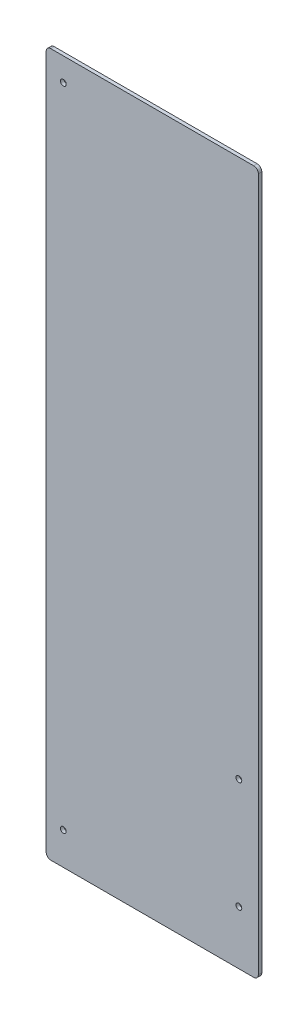
ISO-10303-21;
HEADER;
FILE_DESCRIPTION(('STEP AP214'),'2;1');
FILE_NAME('part.step','',(''),(''),'','','');
FILE_SCHEMA(('AUTOMOTIVE_DESIGN { 1 0 10303 214 1 1 1 1 }'));
ENDSEC;
DATA;
#1=APPLICATION_CONTEXT('core data for automotive mechanical design processes');
#2=APPLICATION_PROTOCOL_DEFINITION('international standard','automotive_design',2000,#1);
#3=PRODUCT_CONTEXT('',#1,'mechanical');
#4=PRODUCT('Part','Part','',(#3));
#5=PRODUCT_RELATED_PRODUCT_CATEGORY('part','',(#4));
#6=PRODUCT_DEFINITION_FORMATION('','',#4);
#7=PRODUCT_DEFINITION_CONTEXT('part definition',#1,'design');
#8=PRODUCT_DEFINITION('design','',#6,#7);
#9=PRODUCT_DEFINITION_SHAPE('','',#8);
#10=(LENGTH_UNIT() NAMED_UNIT(*) SI_UNIT(.MILLI.,.METRE.));
#11=(NAMED_UNIT(*) PLANE_ANGLE_UNIT() SI_UNIT($,.RADIAN.));
#12=(NAMED_UNIT(*) SI_UNIT($,.STERADIAN.) SOLID_ANGLE_UNIT());
#13=UNCERTAINTY_MEASURE_WITH_UNIT(LENGTH_MEASURE(1.E-05),#10,'distance_accuracy_value','');
#14=(GEOMETRIC_REPRESENTATION_CONTEXT(3) GLOBAL_UNCERTAINTY_ASSIGNED_CONTEXT((#13)) GLOBAL_UNIT_ASSIGNED_CONTEXT((#10,
#11,#12)) REPRESENTATION_CONTEXT('',''));
#15=CARTESIAN_POINT('',(0.,0.,0.));
#16=DIRECTION('',(0.,0.,1.));
#17=DIRECTION('',(1.,0.,0.));
#18=AXIS2_PLACEMENT_3D('',#15,#16,#17);
#19=CARTESIAN_POINT('',(20.3567439362028,303.,-1.4999999999998));
#20=DIRECTION('',(0.,1.,0.));
#21=DIRECTION('',(1.,0.,0.));
#22=AXIS2_PLACEMENT_3D('',#19,#20,#21);
#23=PLANE('',#22);
#24=DIRECTION('',(-1.,0.,0.));
#25=VECTOR('',#24,1.);
#26=CARTESIAN_POINT('',(20.3567439362028,303.,-1.4999999999998));
#27=LINE('',#26,#25);
#28=CARTESIAN_POINT('',(71.4161463143023,303.,-1.50000000000027));
#29=VERTEX_POINT('',#28);
#30=CARTESIAN_POINT('',(-16.0594023780994,303.,-1.50000000000009));
#31=VERTEX_POINT('',#30);
#32=EDGE_CURVE('E13',#29,#31,#27,.T.);
#33=ORIENTED_EDGE('',*,*,#32,.T.);
#34=DIRECTION('',(0.,0.,1.));
#35=VECTOR('',#34,1.);
#36=CARTESIAN_POINT('',(-16.0594023780994,303.,-1.50000000000009));
#37=LINE('',#36,#35);
#38=CARTESIAN_POINT('',(-16.0594023780994,303.,0.));
#39=VERTEX_POINT('',#38);
#40=EDGE_CURVE('E278',#31,#39,#37,.T.);
#41=ORIENTED_EDGE('',*,*,#40,.T.);
#42=DIRECTION('',(1.,0.,0.));
#43=VECTOR('',#42,1.);
#44=CARTESIAN_POINT('',(20.3567439362028,303.,1.94289029309402E-13));
#45=LINE('',#44,#43);
#46=CARTESIAN_POINT('',(71.4161463143023,303.,-2.70616862252382E-13));
#47=VERTEX_POINT('',#46);
#48=EDGE_CURVE('E179',#47,#39,#45,.F.);
#49=ORIENTED_EDGE('',*,*,#48,.F.);
#50=DIRECTION('',(0.,0.,1.));
#51=VECTOR('',#50,1.);
#52=CARTESIAN_POINT('',(71.4161463143023,303.,-1.50000000000027));
#53=LINE('',#52,#51);
#54=EDGE_CURVE('E222',#47,#29,#53,.F.);
#55=ORIENTED_EDGE('',*,*,#54,.T.);
#56=EDGE_LOOP('',(#33,#41,#49,#55));
#57=FACE_BOUND('',#56,.T.);
#58=ADVANCED_FACE('F107',(#57),#23,.T.);
#59=CARTESIAN_POINT('',(55.3567439362028,0.,-1.50000000000005));
#60=DIRECTION('',(0.,-1.,0.));
#61=DIRECTION('',(-1.,0.,0.));
#62=AXIS2_PLACEMENT_3D('',#59,#60,#61);
#63=PLANE('',#62);
#64=DIRECTION('',(-1.,0.,0.));
#65=VECTOR('',#64,1.);
#66=CARTESIAN_POINT('',(20.3567439362028,0.,1.94289029309402E-13));
#67=LINE('',#66,#65);
#68=CARTESIAN_POINT('',(-16.0594023780994,0.,0.));
#69=VERTEX_POINT('',#68);
#70=CARTESIAN_POINT('',(71.4161463143023,0.,-2.70616862252382E-13));
#71=VERTEX_POINT('',#70);
#72=EDGE_CURVE('E111',#69,#71,#67,.F.);
#73=ORIENTED_EDGE('',*,*,#72,.F.);
#74=DIRECTION('',(0.,0.,1.));
#75=VECTOR('',#74,1.);
#76=CARTESIAN_POINT('',(-16.0594023780994,0.,-1.50000000000009));
#77=LINE('',#76,#75);
#78=CARTESIAN_POINT('',(-16.0594023780994,0.,-1.50000000000009));
#79=VERTEX_POINT('',#78);
#80=EDGE_CURVE('E190',#69,#79,#77,.F.);
#81=ORIENTED_EDGE('',*,*,#80,.T.);
#82=DIRECTION('',(1.,0.,0.));
#83=VECTOR('',#82,1.);
#84=CARTESIAN_POINT('',(55.3567439362028,0.,-1.50000000000005));
#85=LINE('',#84,#83);
#86=CARTESIAN_POINT('',(71.4161463143023,0.,-1.50000000000027));
#87=VERTEX_POINT('',#86);
#88=EDGE_CURVE('E118',#79,#87,#85,.T.);
#89=ORIENTED_EDGE('',*,*,#88,.T.);
#90=DIRECTION('',(0.,0.,1.));
#91=VECTOR('',#90,1.);
#92=CARTESIAN_POINT('',(71.4161463143023,0.,-1.50000000000027));
#93=LINE('',#92,#91);
#94=EDGE_CURVE('E213',#87,#71,#93,.T.);
#95=ORIENTED_EDGE('',*,*,#94,.T.);
#96=EDGE_LOOP('',(#73,#81,#89,#95));
#97=FACE_BOUND('',#96,.T.);
#98=ADVANCED_FACE('F318',(#97),#63,.T.);
#99=CARTESIAN_POINT('',(20.3567439362028,0.,-1.4999999999998));
#100=DIRECTION('',(0.,0.,-1.));
#101=DIRECTION('',(-1.,0.,0.));
#102=AXIS2_PLACEMENT_3D('',#99,#100,#101);
#103=PLANE('',#102);
#104=ORIENTED_EDGE('',*,*,#88,.F.);
#105=CARTESIAN_POINT('',(-16.0594023780994,2.,-1.50000000000009));
#106=DIRECTION('',(0.,0.,1.));
#107=DIRECTION('',(1.,0.,0.));
#108=AXIS2_PLACEMENT_3D('',#105,#106,#107);
#109=CIRCLE('',#108,2.);
#110=CARTESIAN_POINT('',(-18.0594023780994,2.,-1.5000000000001));
#111=VERTEX_POINT('',#110);
#112=EDGE_CURVE('E163',#79,#111,#109,.F.);
#113=ORIENTED_EDGE('',*,*,#112,.T.);
#114=DIRECTION('',(0.,1.,0.));
#115=VECTOR('',#114,1.);
#116=CARTESIAN_POINT('',(-18.0594023780994,0.,-1.5000000000001));
#117=LINE('',#116,#115);
#118=CARTESIAN_POINT('',(-18.0594023780994,301.,-1.5000000000001));
#119=VERTEX_POINT('',#118);
#120=EDGE_CURVE('E200',#111,#119,#117,.T.);
#121=ORIENTED_EDGE('',*,*,#120,.T.);
#122=CARTESIAN_POINT('',(-16.0594023780994,301.,-1.50000000000009));
#123=DIRECTION('',(0.,0.,1.));
#124=DIRECTION('',(1.,0.,0.));
#125=AXIS2_PLACEMENT_3D('',#122,#123,#124);
#126=CIRCLE('',#125,2.);
#127=EDGE_CURVE('E570',#119,#31,#126,.F.);
#128=ORIENTED_EDGE('',*,*,#127,.T.);
#129=ORIENTED_EDGE('',*,*,#32,.F.);
#130=CARTESIAN_POINT('',(71.4161463143023,301.,-1.50000000000027));
#131=DIRECTION('',(0.,0.,1.));
#132=DIRECTION('',(1.,0.,0.));
#133=AXIS2_PLACEMENT_3D('',#130,#131,#132);
#134=CIRCLE('',#133,2.);
#135=CARTESIAN_POINT('',(73.4161463143023,301.,-1.5000000000003));
#136=VERTEX_POINT('',#135);
#137=EDGE_CURVE('E233',#29,#136,#134,.F.);
#138=ORIENTED_EDGE('',*,*,#137,.T.);
#139=DIRECTION('',(0.,-1.,0.));
#140=VECTOR('',#139,1.);
#141=CARTESIAN_POINT('',(73.4161463143023,0.,-1.5000000000003));
#142=LINE('',#141,#140);
#143=CARTESIAN_POINT('',(73.4161463143023,2.,-1.5000000000003));
#144=VERTEX_POINT('',#143);
#145=EDGE_CURVE('E230',#136,#144,#142,.T.);
#146=ORIENTED_EDGE('',*,*,#145,.T.);
#147=CARTESIAN_POINT('',(71.4161463143023,2.,-1.50000000000027));
#148=DIRECTION('',(0.,0.,1.));
#149=DIRECTION('',(1.,0.,0.));
#150=AXIS2_PLACEMENT_3D('',#147,#148,#149);
#151=CIRCLE('',#150,2.);
#152=EDGE_CURVE('E226',#144,#87,#151,.F.);
#153=ORIENTED_EDGE('',*,*,#152,.T.);
#154=EDGE_LOOP('',(#104,#113,#121,#128,#129,#138,#146,#153));
#155=FACE_BOUND('',#154,.T.);
#156=CARTESIAN_POINT('',(65.0161463143023,23.1999999997123,-1.50000000000035));
#157=DIRECTION('',(0.,0.,-1.));
#158=DIRECTION('',(-1.,0.,0.));
#159=AXIS2_PLACEMENT_3D('',#156,#157,#158);
#160=CIRCLE('',#159,1.25000000004071);
#161=CARTESIAN_POINT('',(63.7661463142616,23.1999999997123,-1.50000000000034));
#162=VERTEX_POINT('',#161);
#163=EDGE_CURVE('E236',#162,#162,#160,.T.);
#164=ORIENTED_EDGE('',*,*,#163,.F.);
#165=EDGE_LOOP('',(#164));
#166=FACE_BOUND('',#165,.T.);
#167=CARTESIAN_POINT('',(65.0161463143023,70.7999999997122,-1.50000000000035));
#168=DIRECTION('',(0.,0.,-1.));
#169=DIRECTION('',(-1.,0.,0.));
#170=AXIS2_PLACEMENT_3D('',#167,#168,#169);
#171=CIRCLE('',#170,1.25000000004069);
#172=CARTESIAN_POINT('',(63.7661463142616,70.7999999997122,-1.50000000000034));
#173=VERTEX_POINT('',#172);
#174=EDGE_CURVE('E244',#173,#173,#171,.T.);
#175=ORIENTED_EDGE('',*,*,#174,.F.);
#176=EDGE_LOOP('',(#175));
#177=FACE_BOUND('',#176,.T.);
#178=CARTESIAN_POINT('',(-10.6594023780993,293.00000000032,-1.50000000000005));
#179=DIRECTION('',(0.,0.,-1.));
#180=DIRECTION('',(-1.,0.,0.));
#181=AXIS2_PLACEMENT_3D('',#178,#179,#180);
#182=CIRCLE('',#181,1.24999999999615);
#183=CARTESIAN_POINT('',(-11.9094023780955,293.00000000032,-1.50000000000006));
#184=VERTEX_POINT('',#183);
#185=EDGE_CURVE('E281',#184,#184,#182,.T.);
#186=ORIENTED_EDGE('',*,*,#185,.F.);
#187=EDGE_LOOP('',(#186));
#188=FACE_BOUND('',#187,.T.);
#189=CARTESIAN_POINT('',(-10.6594023780995,14.0000000003198,-1.50000000000005));
#190=DIRECTION('',(0.,0.,-1.));
#191=DIRECTION('',(-1.,0.,0.));
#192=AXIS2_PLACEMENT_3D('',#189,#190,#191);
#193=CIRCLE('',#192,1.24999999999615);
#194=CARTESIAN_POINT('',(-11.9094023780956,14.0000000003198,-1.50000000000006));
#195=VERTEX_POINT('',#194);
#196=EDGE_CURVE('E296',#195,#195,#193,.T.);
#197=ORIENTED_EDGE('',*,*,#196,.F.);
#198=EDGE_LOOP('',(#197));
#199=FACE_BOUND('',#198,.T.);
#200=ADVANCED_FACE('F310',(#155,#166,#177,#188,#199),#103,.T.);
#201=CARTESIAN_POINT('',(0.,0.,0.));
#202=DIRECTION('',(0.,0.,-1.));
#203=DIRECTION('',(-1.,0.,0.));
#204=AXIS2_PLACEMENT_3D('',#201,#202,#203);
#205=PLANE('',#204);
#206=ORIENTED_EDGE('',*,*,#48,.T.);
#207=CARTESIAN_POINT('',(-16.0594023780994,301.,0.));
#208=DIRECTION('',(0.,0.,1.));
#209=DIRECTION('',(1.,0.,0.));
#210=AXIS2_PLACEMENT_3D('',#207,#208,#209);
#211=CIRCLE('',#210,2.);
#212=CARTESIAN_POINT('',(-18.0594023780994,301.,-1.02999206386123E-13));
#213=VERTEX_POINT('',#212);
#214=EDGE_CURVE('E193',#39,#213,#211,.T.);
#215=ORIENTED_EDGE('',*,*,#214,.T.);
#216=DIRECTION('',(0.,-1.,0.));
#217=VECTOR('',#216,1.);
#218=CARTESIAN_POINT('',(-18.0594023780994,303.,-1.02999206386123E-13));
#219=LINE('',#218,#217);
#220=CARTESIAN_POINT('',(-18.0594023780994,2.,-1.02999206386123E-13));
#221=VERTEX_POINT('',#220);
#222=EDGE_CURVE('E198',#221,#213,#219,.F.);
#223=ORIENTED_EDGE('',*,*,#222,.F.);
#224=CARTESIAN_POINT('',(-16.0594023780994,2.,0.));
#225=DIRECTION('',(0.,0.,1.));
#226=DIRECTION('',(1.,0.,0.));
#227=AXIS2_PLACEMENT_3D('',#224,#225,#226);
#228=CIRCLE('',#227,2.);
#229=EDGE_CURVE('E185',#221,#69,#228,.T.);
#230=ORIENTED_EDGE('',*,*,#229,.T.);
#231=ORIENTED_EDGE('',*,*,#72,.T.);
#232=CARTESIAN_POINT('',(71.4161463143023,2.,-2.70616862252382E-13));
#233=DIRECTION('',(0.,0.,1.));
#234=DIRECTION('',(1.,0.,0.));
#235=AXIS2_PLACEMENT_3D('',#232,#233,#234);
#236=CIRCLE('',#235,2.);
#237=CARTESIAN_POINT('',(73.4161463143023,2.,-2.98372437868011E-13));
#238=VERTEX_POINT('',#237);
#239=EDGE_CURVE('E127',#71,#238,#236,.T.);
#240=ORIENTED_EDGE('',*,*,#239,.T.);
#241=DIRECTION('',(0.,1.,0.));
#242=VECTOR('',#241,1.);
#243=CARTESIAN_POINT('',(73.4161463143023,0.,-2.98372437868011E-13));
#244=LINE('',#243,#242);
#245=CARTESIAN_POINT('',(73.4161463143023,301.,-2.98372437868011E-13));
#246=VERTEX_POINT('',#245);
#247=EDGE_CURVE('E254',#246,#238,#244,.F.);
#248=ORIENTED_EDGE('',*,*,#247,.F.);
#249=CARTESIAN_POINT('',(71.4161463143023,301.,-2.70616862252382E-13));
#250=DIRECTION('',(0.,0.,1.));
#251=DIRECTION('',(1.,0.,0.));
#252=AXIS2_PLACEMENT_3D('',#249,#250,#251);
#253=CIRCLE('',#252,2.);
#254=EDGE_CURVE('E219',#246,#47,#253,.T.);
#255=ORIENTED_EDGE('',*,*,#254,.T.);
#256=EDGE_LOOP('',(#206,#215,#223,#230,#231,#240,#248,#255));
#257=FACE_BOUND('',#256,.T.);
#258=CARTESIAN_POINT('',(65.0161463143023,23.1999999997123,-1.73472347597681E-13));
#259=DIRECTION('',(0.,0.,1.));
#260=DIRECTION('',(1.,0.,0.));
#261=AXIS2_PLACEMENT_3D('',#258,#259,#260);
#262=CIRCLE('',#261,1.25000000004071);
#263=CARTESIAN_POINT('',(66.266146314343,23.1999999997123,-1.91137505215547E-13));
#264=VERTEX_POINT('',#263);
#265=EDGE_CURVE('E240',#264,#264,#262,.T.);
#266=ORIENTED_EDGE('',*,*,#265,.F.);
#267=EDGE_LOOP('',(#266));
#268=FACE_BOUND('',#267,.T.);
#269=CARTESIAN_POINT('',(65.0161463143023,70.7999999997122,-1.73472347597681E-13));
#270=DIRECTION('',(0.,0.,1.));
#271=DIRECTION('',(1.,0.,0.));
#272=AXIS2_PLACEMENT_3D('',#269,#270,#271);
#273=CIRCLE('',#272,1.25000000004069);
#274=CARTESIAN_POINT('',(66.266146314343,70.7999999997122,-1.91137505215547E-13));
#275=VERTEX_POINT('',#274);
#276=EDGE_CURVE('E248',#275,#275,#273,.T.);
#277=ORIENTED_EDGE('',*,*,#276,.F.);
#278=EDGE_LOOP('',(#277));
#279=FACE_BOUND('',#278,.T.);
#280=CARTESIAN_POINT('',(-10.6594023780994,293.00000000032,0.));
#281=DIRECTION('',(0.,0.,1.));
#282=DIRECTION('',(1.,0.,0.));
#283=AXIS2_PLACEMENT_3D('',#280,#281,#282);
#284=CIRCLE('',#283,1.24999999999615);
#285=CARTESIAN_POINT('',(-9.4094023781032,293.00000000032,0.));
#286=VERTEX_POINT('',#285);
#287=EDGE_CURVE('E290',#286,#286,#284,.T.);
#288=ORIENTED_EDGE('',*,*,#287,.F.);
#289=EDGE_LOOP('',(#288));
#290=FACE_BOUND('',#289,.T.);
#291=CARTESIAN_POINT('',(-10.6594023780995,14.0000000003198,0.));
#292=DIRECTION('',(0.,0.,1.));
#293=DIRECTION('',(1.,0.,0.));
#294=AXIS2_PLACEMENT_3D('',#291,#292,#293);
#295=CIRCLE('',#294,1.24999999999615);
#296=CARTESIAN_POINT('',(-9.40940237810332,14.0000000003198,0.));
#297=VERTEX_POINT('',#296);
#298=EDGE_CURVE('E202',#297,#297,#295,.T.);
#299=ORIENTED_EDGE('',*,*,#298,.F.);
#300=EDGE_LOOP('',(#299));
#301=FACE_BOUND('',#300,.T.);
#302=ADVANCED_FACE('F109',(#257,#268,#279,#290,#301),#205,.F.);
#303=CARTESIAN_POINT('',(71.4161463143023,2.,-1.50000000000027));
#304=DIRECTION('',(0.,0.,1.));
#305=DIRECTION('',(1.,0.,0.));
#306=AXIS2_PLACEMENT_3D('',#303,#304,#305);
#307=CYLINDRICAL_SURFACE('',#306,2.);
#308=ORIENTED_EDGE('',*,*,#152,.F.);
#309=DIRECTION('',(0.,0.,1.));
#310=VECTOR('',#309,1.);
#311=CARTESIAN_POINT('',(73.4161463143023,2.,-1.5000000000003));
#312=LINE('',#311,#310);
#313=EDGE_CURVE('E151',#238,#144,#312,.F.);
#314=ORIENTED_EDGE('',*,*,#313,.F.);
#315=ORIENTED_EDGE('',*,*,#239,.F.);
#316=ORIENTED_EDGE('',*,*,#94,.F.);
#317=EDGE_LOOP('',(#308,#314,#315,#316));
#318=FACE_BOUND('',#317,.T.);
#319=ADVANCED_FACE('F309',(#318),#307,.T.);
#320=CARTESIAN_POINT('',(73.4161463143023,0.,-1.5000000000003));
#321=DIRECTION('',(-1.,0.,0.));
#322=DIRECTION('',(0.,0.,1.));
#323=AXIS2_PLACEMENT_3D('',#320,#321,#322);
#324=PLANE('',#323);
#325=ORIENTED_EDGE('',*,*,#145,.F.);
#326=DIRECTION('',(0.,0.,1.));
#327=VECTOR('',#326,1.);
#328=CARTESIAN_POINT('',(73.4161463143023,301.,-1.5000000000003));
#329=LINE('',#328,#327);
#330=EDGE_CURVE('E257',#136,#246,#329,.T.);
#331=ORIENTED_EDGE('',*,*,#330,.T.);
#332=ORIENTED_EDGE('',*,*,#247,.T.);
#333=ORIENTED_EDGE('',*,*,#313,.T.);
#334=EDGE_LOOP('',(#325,#331,#332,#333));
#335=FACE_BOUND('',#334,.T.);
#336=ADVANCED_FACE('F315',(#335),#324,.F.);
#337=CARTESIAN_POINT('',(71.4161463143023,301.,-1.50000000000027));
#338=DIRECTION('',(0.,0.,1.));
#339=DIRECTION('',(1.,0.,0.));
#340=AXIS2_PLACEMENT_3D('',#337,#338,#339);
#341=CYLINDRICAL_SURFACE('',#340,2.);
#342=ORIENTED_EDGE('',*,*,#137,.F.);
#343=ORIENTED_EDGE('',*,*,#54,.F.);
#344=ORIENTED_EDGE('',*,*,#254,.F.);
#345=ORIENTED_EDGE('',*,*,#330,.F.);
#346=EDGE_LOOP('',(#342,#343,#344,#345));
#347=FACE_BOUND('',#346,.T.);
#348=ADVANCED_FACE('F334',(#347),#341,.T.);
#349=CARTESIAN_POINT('',(65.0161463143023,70.7999999997122,8.49999999999965));
#350=DIRECTION('',(0.,0.,-1.));
#351=DIRECTION('',(-1.,0.,0.));
#352=AXIS2_PLACEMENT_3D('',#349,#350,#351);
#353=CYLINDRICAL_SURFACE('',#352,1.25000000004069);
#354=ORIENTED_EDGE('',*,*,#276,.T.);
#355=EDGE_LOOP('',(#354));
#356=FACE_BOUND('',#355,.T.);
#357=ORIENTED_EDGE('',*,*,#174,.T.);
#358=EDGE_LOOP('',(#357));
#359=FACE_BOUND('',#358,.T.);
#360=ADVANCED_FACE('F330',(#356,#359),#353,.F.);
#361=CARTESIAN_POINT('',(65.0161463143023,23.1999999997123,8.49999999999965));
#362=DIRECTION('',(0.,0.,-1.));
#363=DIRECTION('',(-1.,0.,0.));
#364=AXIS2_PLACEMENT_3D('',#361,#362,#363);
#365=CYLINDRICAL_SURFACE('',#364,1.25000000004071);
#366=ORIENTED_EDGE('',*,*,#265,.T.);
#367=EDGE_LOOP('',(#366));
#368=FACE_BOUND('',#367,.T.);
#369=ORIENTED_EDGE('',*,*,#163,.T.);
#370=EDGE_LOOP('',(#369));
#371=FACE_BOUND('',#370,.T.);
#372=ADVANCED_FACE('F327',(#368,#371),#365,.F.);
#373=CARTESIAN_POINT('',(-16.0594023780994,2.,-1.50000000000009));
#374=DIRECTION('',(0.,0.,1.));
#375=DIRECTION('',(1.,0.,0.));
#376=AXIS2_PLACEMENT_3D('',#373,#374,#375);
#377=CYLINDRICAL_SURFACE('',#376,2.);
#378=ORIENTED_EDGE('',*,*,#112,.F.);
#379=ORIENTED_EDGE('',*,*,#80,.F.);
#380=ORIENTED_EDGE('',*,*,#229,.F.);
#381=DIRECTION('',(0.,0.,1.));
#382=VECTOR('',#381,1.);
#383=CARTESIAN_POINT('',(-18.0594023780994,2.,-1.5000000000001));
#384=LINE('',#383,#382);
#385=EDGE_CURVE('E188',#111,#221,#384,.T.);
#386=ORIENTED_EDGE('',*,*,#385,.F.);
#387=EDGE_LOOP('',(#378,#379,#380,#386));
#388=FACE_BOUND('',#387,.T.);
#389=ADVANCED_FACE('F187',(#388),#377,.T.);
#390=CARTESIAN_POINT('',(-16.0594023780994,301.,-1.50000000000009));
#391=DIRECTION('',(0.,0.,1.));
#392=DIRECTION('',(1.,0.,0.));
#393=AXIS2_PLACEMENT_3D('',#390,#391,#392);
#394=CYLINDRICAL_SURFACE('',#393,2.);
#395=ORIENTED_EDGE('',*,*,#127,.F.);
#396=DIRECTION('',(0.,0.,1.));
#397=VECTOR('',#396,1.);
#398=CARTESIAN_POINT('',(-18.0594023780994,301.,-1.5000000000001));
#399=LINE('',#398,#397);
#400=EDGE_CURVE('E203',#213,#119,#399,.F.);
#401=ORIENTED_EDGE('',*,*,#400,.F.);
#402=ORIENTED_EDGE('',*,*,#214,.F.);
#403=ORIENTED_EDGE('',*,*,#40,.F.);
#404=EDGE_LOOP('',(#395,#401,#402,#403));
#405=FACE_BOUND('',#404,.T.);
#406=ADVANCED_FACE('F349',(#405),#394,.T.);
#407=CARTESIAN_POINT('',(-18.0594023780994,303.,-1.5000000000001));
#408=DIRECTION('',(1.,0.,0.));
#409=DIRECTION('',(0.,0.,-1.));
#410=AXIS2_PLACEMENT_3D('',#407,#408,#409);
#411=PLANE('',#410);
#412=ORIENTED_EDGE('',*,*,#222,.T.);
#413=ORIENTED_EDGE('',*,*,#400,.T.);
#414=ORIENTED_EDGE('',*,*,#120,.F.);
#415=ORIENTED_EDGE('',*,*,#385,.T.);
#416=EDGE_LOOP('',(#412,#413,#414,#415));
#417=FACE_BOUND('',#416,.T.);
#418=ADVANCED_FACE('F197',(#417),#411,.F.);
#419=CARTESIAN_POINT('',(-10.6594023780995,14.0000000003198,8.49999999999995));
#420=DIRECTION('',(0.,0.,-1.));
#421=DIRECTION('',(-1.,0.,0.));
#422=AXIS2_PLACEMENT_3D('',#419,#420,#421);
#423=CYLINDRICAL_SURFACE('',#422,1.24999999999615);
#424=ORIENTED_EDGE('',*,*,#298,.T.);
#425=EDGE_LOOP('',(#424));
#426=FACE_BOUND('',#425,.T.);
#427=ORIENTED_EDGE('',*,*,#196,.T.);
#428=EDGE_LOOP('',(#427));
#429=FACE_BOUND('',#428,.T.);
#430=ADVANCED_FACE('F305',(#426,#429),#423,.F.);
#431=CARTESIAN_POINT('',(-10.6594023780994,293.00000000032,8.49999999999995));
#432=DIRECTION('',(0.,0.,-1.));
#433=DIRECTION('',(-1.,0.,0.));
#434=AXIS2_PLACEMENT_3D('',#431,#432,#433);
#435=CYLINDRICAL_SURFACE('',#434,1.24999999999615);
#436=ORIENTED_EDGE('',*,*,#287,.T.);
#437=EDGE_LOOP('',(#436));
#438=FACE_BOUND('',#437,.T.);
#439=ORIENTED_EDGE('',*,*,#185,.T.);
#440=EDGE_LOOP('',(#439));
#441=FACE_BOUND('',#440,.T.);
#442=ADVANCED_FACE('F341',(#438,#441),#435,.F.);
#443=CLOSED_SHELL('',(#58,#98,#200,#302,#319,#336,#348,#360,#372,#389,#406,#418,#430,#442));
#444=MANIFOLD_SOLID_BREP('B2',#443);
#445=ADVANCED_BREP_SHAPE_REPRESENTATION('',(#18,#444),#14);
#446=SHAPE_DEFINITION_REPRESENTATION(#9,#445);
ENDSEC;
END-ISO-10303-21;
